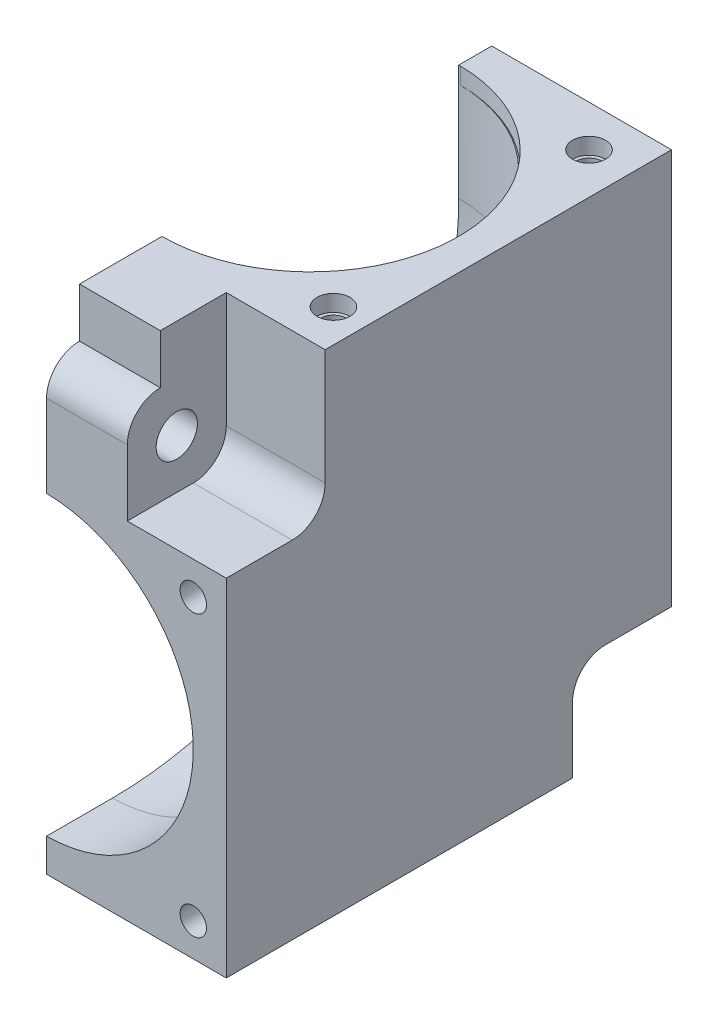
ISO-10303-21;
HEADER;
FILE_DESCRIPTION(('STEP AP214'),'2;1');
FILE_NAME('part.step','',(''),(''),'','','');
FILE_SCHEMA(('AUTOMOTIVE_DESIGN { 1 0 10303 214 1 1 1 1 }'));
ENDSEC;
DATA;
#1=APPLICATION_CONTEXT('core data for automotive mechanical design processes');
#2=APPLICATION_PROTOCOL_DEFINITION('international standard','automotive_design',2000,#1);
#3=PRODUCT_CONTEXT('',#1,'mechanical');
#4=PRODUCT('Part','Part','',(#3));
#5=PRODUCT_RELATED_PRODUCT_CATEGORY('part','',(#4));
#6=PRODUCT_DEFINITION_FORMATION('','',#4);
#7=PRODUCT_DEFINITION_CONTEXT('part definition',#1,'design');
#8=PRODUCT_DEFINITION('design','',#6,#7);
#9=PRODUCT_DEFINITION_SHAPE('','',#8);
#10=(LENGTH_UNIT() NAMED_UNIT(*) SI_UNIT(.MILLI.,.METRE.));
#11=(NAMED_UNIT(*) PLANE_ANGLE_UNIT() SI_UNIT($,.RADIAN.));
#12=(NAMED_UNIT(*) SI_UNIT($,.STERADIAN.) SOLID_ANGLE_UNIT());
#13=UNCERTAINTY_MEASURE_WITH_UNIT(LENGTH_MEASURE(1.E-05),#10,'distance_accuracy_value','');
#14=(GEOMETRIC_REPRESENTATION_CONTEXT(3) GLOBAL_UNCERTAINTY_ASSIGNED_CONTEXT((#13)) GLOBAL_UNIT_ASSIGNED_CONTEXT((#10,
#11,#12)) REPRESENTATION_CONTEXT('',''));
#15=CARTESIAN_POINT('',(0.,0.,0.));
#16=DIRECTION('',(0.,0.,1.));
#17=DIRECTION('',(1.,0.,0.));
#18=AXIS2_PLACEMENT_3D('',#15,#16,#17);
#19=CARTESIAN_POINT('',(-21.94092982825,118.281418193,122.6520423712));
#20=DIRECTION('',(0.,1.,0.));
#21=DIRECTION('',(0.,0.,1.));
#22=AXIS2_PLACEMENT_3D('',#19,#20,#21);
#23=CONICAL_SURFACE('',#22,0.,1.029744258646);
#24=CARTESIAN_POINT('',(-21.94092982825,118.281418193,122.6520423712));
#25=VERTEX_POINT('',#24);
#26=VERTEX_LOOP('',#25);
#27=FACE_BOUND('',#26,.T.);
#28=CARTESIAN_POINT('',(-21.94092982825,118.7621066882,122.6520423712));
#29=DIRECTION('',(0.,1.,0.));
#30=DIRECTION('',(1.,0.,0.));
#31=AXIS2_PLACEMENT_3D('',#28,#29,#30);
#32=CIRCLE('',#31,0.799999999999999);
#33=CARTESIAN_POINT('',(-21.14092982825,118.7621066882,122.6520423712));
#34=VERTEX_POINT('',#33);
#35=EDGE_CURVE('E220',#34,#34,#32,.F.);
#36=ORIENTED_EDGE('',*,*,#35,.F.);
#37=EDGE_LOOP('',(#36));
#38=FACE_BOUND('',#37,.T.);
#39=ADVANCED_FACE('F16',(#27,#38),#23,.F.);
#40=CARTESIAN_POINT('',(-21.44092982825,118.281418193,138.6520423712));
#41=DIRECTION('',(0.,1.,0.));
#42=DIRECTION('',(0.,0.,1.));
#43=AXIS2_PLACEMENT_3D('',#40,#41,#42);
#44=CONICAL_SURFACE('',#43,0.,1.02974425864599);
#45=CARTESIAN_POINT('',(-21.44092982825,118.281418193,138.6520423712));
#46=VERTEX_POINT('',#45);
#47=VERTEX_LOOP('',#46);
#48=FACE_BOUND('',#47,.T.);
#49=CARTESIAN_POINT('',(-21.44092982825,118.7621066882,138.6520423712));
#50=DIRECTION('',(0.,1.,0.));
#51=DIRECTION('',(1.,0.,0.));
#52=AXIS2_PLACEMENT_3D('',#49,#50,#51);
#53=CIRCLE('',#52,0.800000000000002);
#54=CARTESIAN_POINT('',(-20.64092982825,118.7621066882,138.6520423712));
#55=VERTEX_POINT('',#54);
#56=EDGE_CURVE('E216',#55,#55,#53,.F.);
#57=ORIENTED_EDGE('',*,*,#56,.F.);
#58=EDGE_LOOP('',(#57));
#59=FACE_BOUND('',#58,.T.);
#60=ADVANCED_FACE('F538',(#48,#59),#44,.F.);
#61=CARTESIAN_POINT('',(-21.94092982825,118.7621066882,122.6520423712));
#62=DIRECTION('',(0.,1.,0.));
#63=DIRECTION('',(0.,0.,1.));
#64=AXIS2_PLACEMENT_3D('',#61,#62,#63);
#65=CYLINDRICAL_SURFACE('',#64,0.799999999999999);
#66=CARTESIAN_POINT('',(-21.94092982825,124.7621066882,122.6520423712));
#67=DIRECTION('',(0.,1.,0.));
#68=DIRECTION('',(0.,0.,1.));
#69=AXIS2_PLACEMENT_3D('',#66,#67,#68);
#70=CIRCLE('',#69,0.799999999999999);
#71=CARTESIAN_POINT('',(-21.94092982825,124.7621066882,123.4520423712));
#72=VERTEX_POINT('',#71);
#73=EDGE_CURVE('E20',#72,#72,#70,.F.);
#74=ORIENTED_EDGE('',*,*,#73,.F.);
#75=EDGE_LOOP('',(#74));
#76=FACE_BOUND('',#75,.T.);
#77=ORIENTED_EDGE('',*,*,#35,.T.);
#78=EDGE_LOOP('',(#77));
#79=FACE_BOUND('',#78,.T.);
#80=ADVANCED_FACE('F344',(#76,#79),#65,.F.);
#81=CARTESIAN_POINT('',(-21.44092982825,118.7621066882,138.6520423712));
#82=DIRECTION('',(0.,1.,0.));
#83=DIRECTION('',(0.,0.,1.));
#84=AXIS2_PLACEMENT_3D('',#81,#82,#83);
#85=CYLINDRICAL_SURFACE('',#84,0.800000000000002);
#86=CARTESIAN_POINT('',(-21.44092982825,124.7621066882,138.6520423712));
#87=DIRECTION('',(0.,1.,0.));
#88=DIRECTION('',(0.,0.,1.));
#89=AXIS2_PLACEMENT_3D('',#86,#87,#88);
#90=CIRCLE('',#89,0.800000000000002);
#91=CARTESIAN_POINT('',(-21.44092982825,124.7621066882,139.4520423712));
#92=VERTEX_POINT('',#91);
#93=EDGE_CURVE('E203',#92,#92,#90,.F.);
#94=ORIENTED_EDGE('',*,*,#93,.F.);
#95=EDGE_LOOP('',(#94));
#96=FACE_BOUND('',#95,.T.);
#97=ORIENTED_EDGE('',*,*,#56,.T.);
#98=EDGE_LOOP('',(#97));
#99=FACE_BOUND('',#98,.T.);
#100=ADVANCED_FACE('F335',(#96,#99),#85,.F.);
#101=CARTESIAN_POINT('',(-20.89076503479,124.7621066882,123.7022105524));
#102=DIRECTION('',(0.,1.,0.));
#103=DIRECTION('',(0.,0.,-1.));
#104=AXIS2_PLACEMENT_3D('',#101,#102,#103);
#105=PLANE('',#104);
#106=ORIENTED_EDGE('',*,*,#73,.T.);
#107=EDGE_LOOP('',(#106));
#108=FACE_BOUND('',#107,.T.);
#109=CARTESIAN_POINT('',(-21.94092982825,124.762106688251,122.6520423712));
#110=DIRECTION('',(0.,-1.,0.));
#111=DIRECTION('',(0.,0.,-1.));
#112=AXIS2_PLACEMENT_3D('',#109,#110,#111);
#113=CIRCLE('',#112,0.999999999999994);
#114=CARTESIAN_POINT('',(-21.94092982825,124.762106688251,121.6520423712));
#115=VERTEX_POINT('',#114);
#116=EDGE_CURVE('E180',#115,#115,#113,.T.);
#117=ORIENTED_EDGE('',*,*,#116,.F.);
#118=EDGE_LOOP('',(#117));
#119=FACE_BOUND('',#118,.T.);
#120=ADVANCED_FACE('F332',(#108,#119),#105,.T.);
#121=CARTESIAN_POINT('',(-20.39076503479,124.7621066882,139.7022105524));
#122=DIRECTION('',(0.,1.,0.));
#123=DIRECTION('',(0.,0.,-1.));
#124=AXIS2_PLACEMENT_3D('',#121,#122,#123);
#125=PLANE('',#124);
#126=ORIENTED_EDGE('',*,*,#93,.T.);
#127=EDGE_LOOP('',(#126));
#128=FACE_BOUND('',#127,.T.);
#129=CARTESIAN_POINT('',(-21.44092982825,124.762106688251,138.6520423712));
#130=DIRECTION('',(0.,-1.,0.));
#131=DIRECTION('',(0.,0.,-1.));
#132=AXIS2_PLACEMENT_3D('',#129,#130,#131);
#133=CIRCLE('',#132,1.);
#134=CARTESIAN_POINT('',(-21.44092982825,124.762106688251,137.6520423712));
#135=VERTEX_POINT('',#134);
#136=EDGE_CURVE('E321',#135,#135,#133,.T.);
#137=ORIENTED_EDGE('',*,*,#136,.F.);
#138=EDGE_LOOP('',(#137));
#139=FACE_BOUND('',#138,.T.);
#140=ADVANCED_FACE('F334',(#128,#139),#125,.T.);
#141=CARTESIAN_POINT('',(-21.15554887249,124.7621066882,140.5114312426));
#142=DIRECTION('',(0.,1.,0.));
#143=DIRECTION('',(0.,0.,-1.));
#144=AXIS2_PLACEMENT_3D('',#141,#142,#143);
#145=PLANE('',#144);
#146=CARTESIAN_POINT('',(-30.44092982825,124.7621066882,131.1520423712));
#147=DIRECTION('',(0.,1.,0.));
#148=DIRECTION('',(-1.,0.,0.));
#149=AXIS2_PLACEMENT_3D('',#146,#147,#148);
#150=CIRCLE('',#149,9.00000000000003);
#151=CARTESIAN_POINT('',(-30.3409298283999,124.762106688238,140.15148679853));
#152=VERTEX_POINT('',#151);
#153=CARTESIAN_POINT('',(-30.2409421747683,124.762106688238,122.154264593412));
#154=VERTEX_POINT('',#153);
#155=EDGE_CURVE('E166',#152,#154,#150,.T.);
#156=ORIENTED_EDGE('',*,*,#155,.F.);
#157=CARTESIAN_POINT('',(-30.34092982825,124.762106688251,131.1525979439));
#158=DIRECTION('',(0.,-1.,0.));
#159=DIRECTION('',(0.,0.,-1.));
#160=AXIS2_PLACEMENT_3D('',#157,#158,#159);
#161=CIRCLE('',#160,8.99888885459998);
#162=EDGE_CURVE('E171',#154,#152,#161,.T.);
#163=ORIENTED_EDGE('',*,*,#162,.F.);
#164=EDGE_LOOP('',(#156,#163));
#165=FACE_BOUND('',#164,.T.);
#166=ADVANCED_FACE('F194',(#165),#145,.T.);
#167=CARTESIAN_POINT('',(-30.34092982825,125.762106688249,131.1525979439));
#168=DIRECTION('',(0.,-1.,0.));
#169=DIRECTION('',(0.,0.,-1.));
#170=AXIS2_PLACEMENT_3D('',#167,#168,#169);
#171=CYLINDRICAL_SURFACE('',#170,8.99888885459998);
#172=DIRECTION('',(0.,1.,0.));
#173=VECTOR('',#172,1.);
#174=CARTESIAN_POINT('',(-30.2409421743138,122.2621066882,122.154264593422));
#175=LINE('',#174,#173);
#176=CARTESIAN_POINT('',(-30.2409421747683,125.762106688237,122.154264593412));
#177=VERTEX_POINT('',#176);
#178=EDGE_CURVE('E177',#154,#177,#175,.T.);
#179=ORIENTED_EDGE('',*,*,#178,.F.);
#180=ORIENTED_EDGE('',*,*,#162,.T.);
#181=DIRECTION('',(0.,1.,0.));
#182=VECTOR('',#181,1.);
#183=CARTESIAN_POINT('',(-30.3409298282537,125.26210668825,140.1514867985));
#184=LINE('',#183,#182);
#185=CARTESIAN_POINT('',(-30.3409298282519,125.762106688249,140.1514867985));
#186=VERTEX_POINT('',#185);
#187=EDGE_CURVE('E175',#152,#186,#184,.T.);
#188=ORIENTED_EDGE('',*,*,#187,.T.);
#189=CARTESIAN_POINT('',(-30.34092982825,125.762106688249,131.1525979439));
#190=DIRECTION('',(0.,-1.,0.));
#191=DIRECTION('',(0.,0.,-1.));
#192=AXIS2_PLACEMENT_3D('',#189,#190,#191);
#193=CIRCLE('',#192,8.99888885459998);
#194=EDGE_CURVE('E307',#177,#186,#193,.T.);
#195=ORIENTED_EDGE('',*,*,#194,.F.);
#196=EDGE_LOOP('',(#179,#180,#188,#195));
#197=FACE_BOUND('',#196,.T.);
#198=ADVANCED_FACE('F172',(#197),#171,.F.);
#199=CARTESIAN_POINT('',(-21.94092982825,125.762106688249,122.6520423712));
#200=DIRECTION('',(0.,-1.,0.));
#201=DIRECTION('',(0.,0.,-1.));
#202=AXIS2_PLACEMENT_3D('',#199,#200,#201);
#203=CYLINDRICAL_SURFACE('',#202,0.999999999999994);
#204=CARTESIAN_POINT('',(-21.94092982825,125.762106688249,122.6520423712));
#205=DIRECTION('',(0.,-1.,0.));
#206=DIRECTION('',(0.,0.,-1.));
#207=AXIS2_PLACEMENT_3D('',#204,#205,#206);
#208=CIRCLE('',#207,0.999999999999994);
#209=CARTESIAN_POINT('',(-21.94092982825,125.762106688249,121.6520423712));
#210=VERTEX_POINT('',#209);
#211=EDGE_CURVE('E302',#210,#210,#208,.T.);
#212=ORIENTED_EDGE('',*,*,#211,.F.);
#213=EDGE_LOOP('',(#212));
#214=FACE_BOUND('',#213,.T.);
#215=ORIENTED_EDGE('',*,*,#116,.T.);
#216=EDGE_LOOP('',(#215));
#217=FACE_BOUND('',#216,.T.);
#218=ADVANCED_FACE('F330',(#214,#217),#203,.F.);
#219=CARTESIAN_POINT('',(-21.44092982825,125.762106688249,138.6520423712));
#220=DIRECTION('',(0.,-1.,0.));
#221=DIRECTION('',(0.,0.,-1.));
#222=AXIS2_PLACEMENT_3D('',#219,#220,#221);
#223=CYLINDRICAL_SURFACE('',#222,1.);
#224=CARTESIAN_POINT('',(-21.44092982825,125.762106688249,138.6520423712));
#225=DIRECTION('',(0.,-1.,0.));
#226=DIRECTION('',(0.,0.,-1.));
#227=AXIS2_PLACEMENT_3D('',#224,#225,#226);
#228=CIRCLE('',#227,1.);
#229=CARTESIAN_POINT('',(-21.44092982825,125.762106688249,137.6520423712));
#230=VERTEX_POINT('',#229);
#231=EDGE_CURVE('E297',#230,#230,#228,.T.);
#232=ORIENTED_EDGE('',*,*,#231,.F.);
#233=EDGE_LOOP('',(#232));
#234=FACE_BOUND('',#233,.T.);
#235=ORIENTED_EDGE('',*,*,#136,.T.);
#236=EDGE_LOOP('',(#235));
#237=FACE_BOUND('',#236,.T.);
#238=ADVANCED_FACE('F527',(#234,#237),#223,.F.);
#239=CARTESIAN_POINT('',(-25.44092982825,95.64210668824,120.0320423712));
#240=DIRECTION('',(-1.,0.,0.));
#241=DIRECTION('',(0.,0.,1.));
#242=AXIS2_PLACEMENT_3D('',#239,#240,#241);
#243=PLANE('',#242);
#244=CARTESIAN_POINT('',(-25.4409298282502,98.76210668824,123.1520423712));
#245=DIRECTION('',(1.,0.,0.));
#246=DIRECTION('',(0.,0.,-1.));
#247=AXIS2_PLACEMENT_3D('',#244,#245,#246);
#248=CIRCLE('',#247,1.25000000000003);
#249=CARTESIAN_POINT('',(-25.4409298282502,98.76210668824,121.9020423712));
#250=VERTEX_POINT('',#249);
#251=EDGE_CURVE('E313',#250,#250,#248,.T.);
#252=ORIENTED_EDGE('',*,*,#251,.F.);
#253=EDGE_LOOP('',(#252));
#254=FACE_BOUND('',#253,.T.);
#255=CARTESIAN_POINT('',(-25.4409298282498,99.76210668824,124.1520423712));
#256=DIRECTION('',(-1.,0.,0.));
#257=DIRECTION('',(0.,0.,1.));
#258=AXIS2_PLACEMENT_3D('',#255,#256,#257);
#259=CIRCLE('',#258,2.00000000000002);
#260=CARTESIAN_POINT('',(-25.4409298282499,99.76210668824,126.1520423712));
#261=VERTEX_POINT('',#260);
#262=CARTESIAN_POINT('',(-25.4409298282498,101.76210668822,124.1520423712));
#263=VERTEX_POINT('',#262);
#264=EDGE_CURVE('E292',#261,#263,#259,.T.);
#265=ORIENTED_EDGE('',*,*,#264,.F.);
#266=DIRECTION('',(0.,-1.,0.));
#267=VECTOR('',#266,1.);
#268=CARTESIAN_POINT('',(-25.44092982825,97.76210668824,126.1520423712));
#269=LINE('',#268,#267);
#270=CARTESIAN_POINT('',(-25.44092982825,95.76210668824,126.1520423712));
#271=VERTEX_POINT('',#270);
#272=EDGE_CURVE('E447',#261,#271,#269,.T.);
#273=ORIENTED_EDGE('',*,*,#272,.T.);
#274=DIRECTION('',(0.,0.,-1.));
#275=VECTOR('',#274,1.);
#276=CARTESIAN_POINT('',(-25.44092982825,95.76210668824,134.6520423712));
#277=LINE('',#276,#275);
#278=CARTESIAN_POINT('',(-25.4409298282501,95.76210668824,122.1520423712));
#279=VERTEX_POINT('',#278);
#280=EDGE_CURVE('E463',#271,#279,#277,.T.);
#281=ORIENTED_EDGE('',*,*,#280,.T.);
#282=CARTESIAN_POINT('',(-25.4409298282502,97.76210668824,122.1520423712));
#283=DIRECTION('',(1.,0.,0.));
#284=DIRECTION('',(0.,0.,-1.));
#285=AXIS2_PLACEMENT_3D('',#282,#283,#284);
#286=CIRCLE('',#285,2.);
#287=CARTESIAN_POINT('',(-25.4409298282501,97.7621066882396,120.1520423712));
#288=VERTEX_POINT('',#287);
#289=EDGE_CURVE('E317',#279,#288,#286,.T.);
#290=ORIENTED_EDGE('',*,*,#289,.T.);
#291=DIRECTION('',(0.,-1.,0.));
#292=VECTOR('',#291,1.);
#293=CARTESIAN_POINT('',(-25.44092982825,111.76210668822,120.1520423712));
#294=LINE('',#293,#292);
#295=CARTESIAN_POINT('',(-25.44092982825,101.7621066882,120.1520423712));
#296=VERTEX_POINT('',#295);
#297=EDGE_CURVE('E484',#296,#288,#294,.T.);
#298=ORIENTED_EDGE('',*,*,#297,.F.);
#299=DIRECTION('',(0.,0.,1.));
#300=VECTOR('',#299,1.);
#301=CARTESIAN_POINT('',(-25.44092982825,101.7621066882,122.1520423712));
#302=LINE('',#301,#300);
#303=EDGE_CURVE('E474',#296,#263,#302,.T.);
#304=ORIENTED_EDGE('',*,*,#303,.T.);
#305=EDGE_LOOP('',(#265,#273,#281,#290,#298,#304));
#306=FACE_BOUND('',#305,.T.);
#307=ADVANCED_FACE('F525',(#254,#306),#243,.F.);
#308=CARTESIAN_POINT('',(-30.34092982825,97.76210668824,122.1520423712));
#309=DIRECTION('',(1.,0.,0.));
#310=DIRECTION('',(0.,0.,-1.));
#311=AXIS2_PLACEMENT_3D('',#308,#309,#310);
#312=CYLINDRICAL_SURFACE('',#311,2.);
#313=ORIENTED_EDGE('',*,*,#289,.F.);
#314=DIRECTION('',(-1.,0.,0.));
#315=VECTOR('',#314,1.);
#316=CARTESIAN_POINT('',(-24.89092982825,95.76210668824,122.1520423712));
#317=LINE('',#316,#315);
#318=CARTESIAN_POINT('',(-30.34092982825,95.7621066882396,122.1520423712));
#319=VERTEX_POINT('',#318);
#320=EDGE_CURVE('E446',#279,#319,#317,.T.);
#321=ORIENTED_EDGE('',*,*,#320,.T.);
#322=CARTESIAN_POINT('',(-30.34092982825,97.76210668824,122.1520423712));
#323=DIRECTION('',(1.,0.,0.));
#324=DIRECTION('',(0.,0.,-1.));
#325=AXIS2_PLACEMENT_3D('',#322,#323,#324);
#326=CIRCLE('',#325,2.);
#327=CARTESIAN_POINT('',(-30.34092982825,97.7621066882396,120.1520423712));
#328=VERTEX_POINT('',#327);
#329=EDGE_CURVE('E282',#319,#328,#326,.T.);
#330=ORIENTED_EDGE('',*,*,#329,.T.);
#331=DIRECTION('',(-1.,0.,0.));
#332=VECTOR('',#331,1.);
#333=CARTESIAN_POINT('',(-24.89092982825,97.7621066882392,120.1520423712));
#334=LINE('',#333,#332);
#335=EDGE_CURVE('E946',#288,#328,#334,.T.);
#336=ORIENTED_EDGE('',*,*,#335,.F.);
#337=EDGE_LOOP('',(#313,#321,#330,#336));
#338=FACE_BOUND('',#337,.T.);
#339=ADVANCED_FACE('F521',(#338),#312,.T.);
#340=CARTESIAN_POINT('',(-30.34092982825,98.76210668824,123.1520423712));
#341=DIRECTION('',(1.,0.,0.));
#342=DIRECTION('',(0.,0.,-1.));
#343=AXIS2_PLACEMENT_3D('',#340,#341,#342);
#344=CYLINDRICAL_SURFACE('',#343,1.25000000000003);
#345=ORIENTED_EDGE('',*,*,#251,.T.);
#346=EDGE_LOOP('',(#345));
#347=FACE_BOUND('',#346,.T.);
#348=CARTESIAN_POINT('',(-30.34092982825,98.76210668824,123.1520423712));
#349=DIRECTION('',(1.,0.,0.));
#350=DIRECTION('',(0.,0.,-1.));
#351=AXIS2_PLACEMENT_3D('',#348,#349,#350);
#352=CIRCLE('',#351,1.25000000000003);
#353=CARTESIAN_POINT('',(-30.34092982825,98.76210668824,121.9020423712));
#354=VERTEX_POINT('',#353);
#355=EDGE_CURVE('E276',#354,#354,#352,.F.);
#356=ORIENTED_EDGE('',*,*,#355,.T.);
#357=EDGE_LOOP('',(#356));
#358=FACE_BOUND('',#357,.T.);
#359=ADVANCED_FACE('F516',(#347,#358),#344,.F.);
#360=CARTESIAN_POINT('',(-30.44092982825,118.7621066882,143.1520423712));
#361=DIRECTION('',(-1.,0.,0.));
#362=DIRECTION('',(0.,0.,1.));
#363=AXIS2_PLACEMENT_3D('',#360,#361,#362);
#364=TOROIDAL_SURFACE('',#363,12.,9.);
#365=CARTESIAN_POINT('',(-30.44092982825,118.7621066882,131.1520423712));
#366=DIRECTION('',(0.,1.,0.));
#367=DIRECTION('',(0.,0.,-1.));
#368=AXIS2_PLACEMENT_3D('',#365,#366,#367);
#369=CIRCLE('',#368,9.00000000000004);
#370=CARTESIAN_POINT('',(-30.34092982825,118.7621066882,122.152597943902));
#371=VERTEX_POINT('',#370);
#372=CARTESIAN_POINT('',(-30.34092982825,118.7621066882,140.151486798528));
#373=VERTEX_POINT('',#372);
#374=EDGE_CURVE('E186',#371,#373,#369,.F.);
#375=ORIENTED_EDGE('',*,*,#374,.F.);
#376=CARTESIAN_POINT('',(-30.34092982825,118.7621066882,143.1520423712));
#377=DIRECTION('',(-1.,0.,0.));
#378=DIRECTION('',(0.,0.,1.));
#379=AXIS2_PLACEMENT_3D('',#376,#377,#378);
#380=CIRCLE('',#379,20.9994444272966);
#381=CARTESIAN_POINT('',(-30.3409298282508,97.7626622609034,143.1520423712));
#382=VERTEX_POINT('',#381);
#383=EDGE_CURVE('E287',#371,#382,#380,.T.);
#384=ORIENTED_EDGE('',*,*,#383,.T.);
#385=CARTESIAN_POINT('',(-30.44092982825,106.7621066882,143.1520423712));
#386=DIRECTION('',(0.,0.,1.));
#387=DIRECTION('',(1.,0.,0.));
#388=AXIS2_PLACEMENT_3D('',#385,#386,#387);
#389=CIRCLE('',#388,8.99999999999999);
#390=CARTESIAN_POINT('',(-30.34092982825,115.761551115528,143.1520423712));
#391=VERTEX_POINT('',#390);
#392=EDGE_CURVE('E429',#391,#382,#389,.F.);
#393=ORIENTED_EDGE('',*,*,#392,.F.);
#394=CARTESIAN_POINT('',(-30.34092982825,118.7621066882,143.1520423712));
#395=DIRECTION('',(-1.,0.,0.));
#396=DIRECTION('',(0.,0.,1.));
#397=AXIS2_PLACEMENT_3D('',#394,#395,#396);
#398=CIRCLE('',#397,3.0005555727034);
#399=EDGE_CURVE('E192',#391,#373,#398,.F.);
#400=ORIENTED_EDGE('',*,*,#399,.T.);
#401=EDGE_LOOP('',(#375,#384,#393,#400));
#402=FACE_BOUND('',#401,.T.);
#403=ADVANCED_FACE('F512',(#402),#364,.F.);
#404=CARTESIAN_POINT('',(-30.44092982825,118.7621066882,131.1520423712));
#405=DIRECTION('',(0.,1.,0.));
#406=DIRECTION('',(-1.,0.,0.));
#407=AXIS2_PLACEMENT_3D('',#404,#405,#406);
#408=CYLINDRICAL_SURFACE('',#407,9.00000000000003);
#409=ORIENTED_EDGE('',*,*,#155,.T.);
#410=ORIENTED_EDGE('',*,*,#178,.T.);
#411=CARTESIAN_POINT('',(-30.44092982825,125.7621066882,131.1520423712));
#412=DIRECTION('',(0.,1.,0.));
#413=DIRECTION('',(0.,0.,1.));
#414=AXIS2_PLACEMENT_3D('',#411,#412,#413);
#415=CIRCLE('',#414,9.00000000000003);
#416=CARTESIAN_POINT('',(-30.34092982825,125.7621066882,122.152597943902));
#417=VERTEX_POINT('',#416);
#418=EDGE_CURVE('E215',#417,#177,#415,.F.);
#419=ORIENTED_EDGE('',*,*,#418,.F.);
#420=DIRECTION('',(0.,-1.,0.));
#421=VECTOR('',#420,1.);
#422=CARTESIAN_POINT('',(-30.34092982825,110.76210668822,122.1525979439));
#423=LINE('',#422,#421);
#424=EDGE_CURVE('E291',#417,#371,#423,.T.);
#425=ORIENTED_EDGE('',*,*,#424,.T.);
#426=ORIENTED_EDGE('',*,*,#374,.T.);
#427=DIRECTION('',(0.,1.,0.));
#428=VECTOR('',#427,1.);
#429=CARTESIAN_POINT('',(-30.34092982825,120.7618289019,140.15148679856));
#430=LINE('',#429,#428);
#431=EDGE_CURVE('E183',#373,#152,#430,.T.);
#432=ORIENTED_EDGE('',*,*,#431,.T.);
#433=EDGE_LOOP('',(#409,#410,#419,#425,#426,#432));
#434=FACE_BOUND('',#433,.T.);
#435=ADVANCED_FACE('F184',(#434),#408,.F.);
#436=CARTESIAN_POINT('',(-21.44092982825,97.76210668824,140.671353876));
#437=DIRECTION('',(0.,0.,1.));
#438=DIRECTION('',(1.,0.,0.));
#439=AXIS2_PLACEMENT_3D('',#436,#437,#438);
#440=CONICAL_SURFACE('',#439,0.,1.02974425864605);
#441=CARTESIAN_POINT('',(-21.44092982825,97.76210668824,140.671353876));
#442=VERTEX_POINT('',#441);
#443=VERTEX_LOOP('',#442);
#444=FACE_BOUND('',#443,.T.);
#445=CARTESIAN_POINT('',(-21.44092982825,97.76210668824,141.1520423712));
#446=DIRECTION('',(0.,0.,1.));
#447=DIRECTION('',(-1.,0.,0.));
#448=AXIS2_PLACEMENT_3D('',#445,#446,#447);
#449=CIRCLE('',#448,0.799999999999995);
#450=CARTESIAN_POINT('',(-22.24092982825,97.76210668824,141.1520423712));
#451=VERTEX_POINT('',#450);
#452=EDGE_CURVE('E495',#451,#451,#449,.F.);
#453=ORIENTED_EDGE('',*,*,#452,.F.);
#454=EDGE_LOOP('',(#453));
#455=FACE_BOUND('',#454,.T.);
#456=ADVANCED_FACE('F625',(#444,#455),#440,.F.);
#457=CARTESIAN_POINT('',(-21.44092982825,114.7621066882,140.671353876));
#458=DIRECTION('',(0.,0.,1.));
#459=DIRECTION('',(1.,0.,0.));
#460=AXIS2_PLACEMENT_3D('',#457,#458,#459);
#461=CONICAL_SURFACE('',#460,0.,1.02974425864605);
#462=CARTESIAN_POINT('',(-21.44092982825,114.7621066882,140.671353876));
#463=VERTEX_POINT('',#462);
#464=VERTEX_LOOP('',#463);
#465=FACE_BOUND('',#464,.T.);
#466=CARTESIAN_POINT('',(-21.44092982825,114.7621066882,141.1520423712));
#467=DIRECTION('',(0.,0.,1.));
#468=DIRECTION('',(-1.,0.,0.));
#469=AXIS2_PLACEMENT_3D('',#466,#467,#468);
#470=CIRCLE('',#469,0.799999999999995);
#471=CARTESIAN_POINT('',(-22.24092982825,114.7621066882,141.1520423712));
#472=VERTEX_POINT('',#471);
#473=EDGE_CURVE('E490',#472,#472,#470,.F.);
#474=ORIENTED_EDGE('',*,*,#473,.F.);
#475=EDGE_LOOP('',(#474));
#476=FACE_BOUND('',#475,.T.);
#477=ADVANCED_FACE('F632',(#465,#476),#461,.F.);
#478=CARTESIAN_POINT('',(-25.34292982825,125.8221066882,145.1520423712));
#479=DIRECTION('',(0.,0.,-1.));
#480=DIRECTION('',(0.,-1.,0.));
#481=AXIS2_PLACEMENT_3D('',#478,#479,#480);
#482=PLANE('',#481);
#483=DIRECTION('',(1.,0.,0.));
#484=VECTOR('',#483,1.);
#485=CARTESIAN_POINT('',(-27.89092982825,122.7621066882,145.1520423712));
#486=LINE('',#485,#484);
#487=CARTESIAN_POINT('',(-30.34092982825,122.7621066882,145.152042371227));
#488=VERTEX_POINT('',#487);
#489=CARTESIAN_POINT('',(-25.4409298282502,122.7621066882,145.1520423712));
#490=VERTEX_POINT('',#489);
#491=EDGE_CURVE('E269',#488,#490,#486,.T.);
#492=ORIENTED_EDGE('',*,*,#491,.T.);
#493=DIRECTION('',(0.,1.,0.));
#494=VECTOR('',#493,1.);
#495=CARTESIAN_POINT('',(-25.44092982825,121.2621066882,145.1520423712));
#496=LINE('',#495,#494);
#497=CARTESIAN_POINT('',(-25.44092982825,125.7621066882,145.1520423712));
#498=VERTEX_POINT('',#497);
#499=EDGE_CURVE('E259',#490,#498,#496,.T.);
#500=ORIENTED_EDGE('',*,*,#499,.T.);
#501=DIRECTION('',(1.,0.,0.));
#502=VECTOR('',#501,1.);
#503=CARTESIAN_POINT('',(-24.89092982825,125.7621066882,145.1520423712));
#504=LINE('',#503,#502);
#505=CARTESIAN_POINT('',(-30.34092982825,125.762106688233,145.152042371226));
#506=VERTEX_POINT('',#505);
#507=EDGE_CURVE('E306',#506,#498,#504,.T.);
#508=ORIENTED_EDGE('',*,*,#507,.F.);
#509=DIRECTION('',(0.,-1.,0.));
#510=VECTOR('',#509,1.);
#511=CARTESIAN_POINT('',(-30.34092982825,120.7618289019,145.152042371253));
#512=LINE('',#511,#510);
#513=EDGE_CURVE('E421',#506,#488,#512,.T.);
#514=ORIENTED_EDGE('',*,*,#513,.T.);
#515=EDGE_LOOP('',(#492,#500,#508,#514));
#516=FACE_BOUND('',#515,.T.);
#517=ADVANCED_FACE('F640',(#516),#482,.F.);
#518=CARTESIAN_POINT('',(-30.34092982825,119.7621066882,144.1520423712));
#519=DIRECTION('',(1.,0.,0.));
#520=DIRECTION('',(0.,0.,-1.));
#521=AXIS2_PLACEMENT_3D('',#518,#519,#520);
#522=CYLINDRICAL_SURFACE('',#521,1.25);
#523=CARTESIAN_POINT('',(-25.4409298282502,119.7621066882,144.1520423712));
#524=DIRECTION('',(1.,0.,0.));
#525=DIRECTION('',(0.,0.,-1.));
#526=AXIS2_PLACEMENT_3D('',#523,#524,#525);
#527=CIRCLE('',#526,1.25);
#528=CARTESIAN_POINT('',(-25.4409298282502,119.7621066882,142.9020423712));
#529=VERTEX_POINT('',#528);
#530=EDGE_CURVE('E255',#529,#529,#527,.T.);
#531=ORIENTED_EDGE('',*,*,#530,.T.);
#532=EDGE_LOOP('',(#531));
#533=FACE_BOUND('',#532,.T.);
#534=CARTESIAN_POINT('',(-30.34092982825,119.7621066882,144.1520423712));
#535=DIRECTION('',(1.,0.,0.));
#536=DIRECTION('',(0.,0.,-1.));
#537=AXIS2_PLACEMENT_3D('',#534,#535,#536);
#538=CIRCLE('',#537,1.25);
#539=CARTESIAN_POINT('',(-30.34092982825,119.7621066882,142.9020423712));
#540=VERTEX_POINT('',#539);
#541=EDGE_CURVE('E191',#540,#540,#538,.F.);
#542=ORIENTED_EDGE('',*,*,#541,.T.);
#543=EDGE_LOOP('',(#542));
#544=FACE_BOUND('',#543,.T.);
#545=ADVANCED_FACE('F649',(#533,#544),#522,.F.);
#546=CARTESIAN_POINT('',(-30.55892982825,125.7621066882,145.6520423712));
#547=DIRECTION('',(0.,1.,0.));
#548=DIRECTION('',(1.,0.,0.));
#549=AXIS2_PLACEMENT_3D('',#546,#547,#548);
#550=PLANE('',#549);
#551=ORIENTED_EDGE('',*,*,#231,.T.);
#552=EDGE_LOOP('',(#551));
#553=FACE_BOUND('',#552,.T.);
#554=ORIENTED_EDGE('',*,*,#211,.T.);
#555=EDGE_LOOP('',(#554));
#556=FACE_BOUND('',#555,.T.);
#557=ORIENTED_EDGE('',*,*,#507,.T.);
#558=DIRECTION('',(0.,0.,-1.));
#559=VECTOR('',#558,1.);
#560=CARTESIAN_POINT('',(-25.44092982825,125.7621066882,144.1520423712));
#561=LINE('',#560,#559);
#562=CARTESIAN_POINT('',(-25.44092982825,125.7621066882,141.1520423712));
#563=VERTEX_POINT('',#562);
#564=EDGE_CURVE('E396',#498,#563,#561,.T.);
#565=ORIENTED_EDGE('',*,*,#564,.T.);
#566=DIRECTION('',(1.,0.,0.));
#567=VECTOR('',#566,1.);
#568=CARTESIAN_POINT('',(-22.44092982825,125.7621066882,141.1520423712));
#569=LINE('',#568,#567);
#570=CARTESIAN_POINT('',(-19.44092982825,125.762106688201,141.1520423712));
#571=VERTEX_POINT('',#570);
#572=EDGE_CURVE('E442',#563,#571,#569,.T.);
#573=ORIENTED_EDGE('',*,*,#572,.T.);
#574=DIRECTION('',(0.,0.,-1.));
#575=VECTOR('',#574,1.);
#576=CARTESIAN_POINT('',(-19.44092982825,125.762106688201,133.6520423712));
#577=LINE('',#576,#575);
#578=CARTESIAN_POINT('',(-19.44092982825,125.762106688201,120.1520423712));
#579=VERTEX_POINT('',#578);
#580=EDGE_CURVE('E450',#571,#579,#577,.T.);
#581=ORIENTED_EDGE('',*,*,#580,.T.);
#582=DIRECTION('',(1.,0.,0.));
#583=VECTOR('',#582,1.);
#584=CARTESIAN_POINT('',(-24.89092982825,125.762106688201,120.1520423712));
#585=LINE('',#584,#583);
#586=CARTESIAN_POINT('',(-30.34092982825,125.762106688201,120.1520423712));
#587=VERTEX_POINT('',#586);
#588=EDGE_CURVE('E301',#587,#579,#585,.T.);
#589=ORIENTED_EDGE('',*,*,#588,.F.);
#590=DIRECTION('',(0.,0.,1.));
#591=VECTOR('',#590,1.);
#592=CARTESIAN_POINT('',(-30.34092982825,125.762106688201,133.6520423712));
#593=LINE('',#592,#591);
#594=EDGE_CURVE('E441',#587,#417,#593,.T.);
#595=ORIENTED_EDGE('',*,*,#594,.T.);
#596=ORIENTED_EDGE('',*,*,#418,.T.);
#597=ORIENTED_EDGE('',*,*,#194,.T.);
#598=DIRECTION('',(0.,0.,1.));
#599=VECTOR('',#598,1.);
#600=CARTESIAN_POINT('',(-30.34092982825,125.76210668825,143.6517645849));
#601=LINE('',#600,#599);
#602=EDGE_CURVE('E201',#186,#506,#601,.T.);
#603=ORIENTED_EDGE('',*,*,#602,.T.);
#604=EDGE_LOOP('',(#557,#565,#573,#581,#589,#595,#596,#597,#603));
#605=FACE_BOUND('',#604,.T.);
#606=ADVANCED_FACE('F658',(#553,#556,#605),#550,.T.);
#607=CARTESIAN_POINT('',(-19.22292982825,126.3221066882,120.1520423712));
#608=DIRECTION('',(0.,0.,-1.));
#609=DIRECTION('',(0.,-1.,0.));
#610=AXIS2_PLACEMENT_3D('',#607,#608,#609);
#611=PLANE('',#610);
#612=ORIENTED_EDGE('',*,*,#297,.T.);
#613=ORIENTED_EDGE('',*,*,#335,.T.);
#614=DIRECTION('',(0.,1.,0.));
#615=VECTOR('',#614,1.);
#616=CARTESIAN_POINT('',(-30.34092982825,110.76210668822,120.1520423712));
#617=LINE('',#616,#615);
#618=EDGE_CURVE('E281',#328,#587,#617,.T.);
#619=ORIENTED_EDGE('',*,*,#618,.T.);
#620=ORIENTED_EDGE('',*,*,#588,.T.);
#621=DIRECTION('',(0.,-1.,0.));
#622=VECTOR('',#621,1.);
#623=CARTESIAN_POINT('',(-19.44092982825,110.76210668822,120.1520423712));
#624=LINE('',#623,#622);
#625=CARTESIAN_POINT('',(-19.44092982825,101.762106688221,120.1520423712));
#626=VERTEX_POINT('',#625);
#627=EDGE_CURVE('E454',#579,#626,#624,.T.);
#628=ORIENTED_EDGE('',*,*,#627,.T.);
#629=DIRECTION('',(-1.,0.,0.));
#630=VECTOR('',#629,1.);
#631=CARTESIAN_POINT('',(-22.44092982825,101.7621066882,120.1520423712));
#632=LINE('',#631,#630);
#633=EDGE_CURVE('E296',#626,#296,#632,.T.);
#634=ORIENTED_EDGE('',*,*,#633,.T.);
#635=EDGE_LOOP('',(#612,#613,#619,#620,#628,#634));
#636=FACE_BOUND('',#635,.T.);
#637=ADVANCED_FACE('F667',(#636),#611,.T.);
#638=CARTESIAN_POINT('',(-19.32092982825,101.7621066882,124.2320423712));
#639=DIRECTION('',(0.,1.,0.));
#640=DIRECTION('',(0.,0.,-1.));
#641=AXIS2_PLACEMENT_3D('',#638,#639,#640);
#642=PLANE('',#641);
#643=DIRECTION('',(0.,0.,1.));
#644=VECTOR('',#643,1.);
#645=CARTESIAN_POINT('',(-19.44092982825,101.762106688232,133.6520423712));
#646=LINE('',#645,#644);
#647=CARTESIAN_POINT('',(-19.44092982825,101.762106688236,124.1520423712));
#648=VERTEX_POINT('',#647);
#649=EDGE_CURVE('E250',#626,#648,#646,.T.);
#650=ORIENTED_EDGE('',*,*,#649,.T.);
#651=DIRECTION('',(1.,0.,0.));
#652=VECTOR('',#651,1.);
#653=CARTESIAN_POINT('',(-22.44092982825,101.76210668824,124.1520423712));
#654=LINE('',#653,#652);
#655=EDGE_CURVE('E295',#263,#648,#654,.T.);
#656=ORIENTED_EDGE('',*,*,#655,.F.);
#657=ORIENTED_EDGE('',*,*,#303,.F.);
#658=ORIENTED_EDGE('',*,*,#633,.F.);
#659=EDGE_LOOP('',(#650,#656,#657,#658));
#660=FACE_BOUND('',#659,.T.);
#661=ADVANCED_FACE('F676',(#660),#642,.F.);
#662=CARTESIAN_POINT('',(-19.44092982825,99.76210668824,124.1520423712));
#663=DIRECTION('',(-1.,0.,0.));
#664=DIRECTION('',(0.,0.,1.));
#665=AXIS2_PLACEMENT_3D('',#662,#663,#664);
#666=CYLINDRICAL_SURFACE('',#665,2.00000000000002);
#667=CARTESIAN_POINT('',(-19.44092982825,99.76210668824,124.1520423712));
#668=DIRECTION('',(-1.,0.,0.));
#669=DIRECTION('',(0.,0.,1.));
#670=AXIS2_PLACEMENT_3D('',#667,#668,#669);
#671=CIRCLE('',#670,2.00000000000002);
#672=CARTESIAN_POINT('',(-19.44092982825,99.76210668824,126.1520423712));
#673=VERTEX_POINT('',#672);
#674=EDGE_CURVE('E245',#648,#673,#671,.F.);
#675=ORIENTED_EDGE('',*,*,#674,.T.);
#676=DIRECTION('',(-1.,0.,0.));
#677=VECTOR('',#676,1.);
#678=CARTESIAN_POINT('',(-22.44092982825,99.76210668824,126.1520423712));
#679=LINE('',#678,#677);
#680=EDGE_CURVE('E466',#673,#261,#679,.T.);
#681=ORIENTED_EDGE('',*,*,#680,.T.);
#682=ORIENTED_EDGE('',*,*,#264,.T.);
#683=ORIENTED_EDGE('',*,*,#655,.T.);
#684=EDGE_LOOP('',(#675,#681,#682,#683));
#685=FACE_BOUND('',#684,.T.);
#686=ADVANCED_FACE('F685',(#685),#666,.F.);
#687=CARTESIAN_POINT('',(-25.56092982825,95.68210668824,126.1520423712));
#688=DIRECTION('',(0.,0.,1.));
#689=DIRECTION('',(1.,0.,0.));
#690=AXIS2_PLACEMENT_3D('',#687,#688,#689);
#691=PLANE('',#690);
#692=ORIENTED_EDGE('',*,*,#272,.F.);
#693=ORIENTED_EDGE('',*,*,#680,.F.);
#694=DIRECTION('',(0.,-1.,0.));
#695=VECTOR('',#694,1.);
#696=CARTESIAN_POINT('',(-19.44092982825,110.76210668822,126.1520423712));
#697=LINE('',#696,#695);
#698=CARTESIAN_POINT('',(-19.44092982825,95.7621066882395,126.1520423712));
#699=VERTEX_POINT('',#698);
#700=EDGE_CURVE('E249',#673,#699,#697,.T.);
#701=ORIENTED_EDGE('',*,*,#700,.T.);
#702=DIRECTION('',(-1.,0.,0.));
#703=VECTOR('',#702,1.);
#704=CARTESIAN_POINT('',(-24.89092982825,95.76210668824,126.1520423712));
#705=LINE('',#704,#703);
#706=EDGE_CURVE('E459',#699,#271,#705,.T.);
#707=ORIENTED_EDGE('',*,*,#706,.T.);
#708=EDGE_LOOP('',(#692,#693,#701,#707));
#709=FACE_BOUND('',#708,.T.);
#710=ADVANCED_FACE('F694',(#709),#691,.F.);
#711=CARTESIAN_POINT('',(-19.32092982825,118.6221066882,141.1520423712));
#712=DIRECTION('',(0.,0.,-1.));
#713=DIRECTION('',(-1.,0.,0.));
#714=AXIS2_PLACEMENT_3D('',#711,#712,#713);
#715=PLANE('',#714);
#716=DIRECTION('',(-1.,0.,0.));
#717=VECTOR('',#716,1.);
#718=CARTESIAN_POINT('',(-22.44092982825,118.7621066882,141.1520423712));
#719=LINE('',#718,#717);
#720=CARTESIAN_POINT('',(-19.44092982825,118.7621066882,141.1520423712));
#721=VERTEX_POINT('',#720);
#722=CARTESIAN_POINT('',(-25.4409298282499,118.7621066882,141.1520423712));
#723=VERTEX_POINT('',#722);
#724=EDGE_CURVE('E254',#721,#723,#719,.T.);
#725=ORIENTED_EDGE('',*,*,#724,.F.);
#726=DIRECTION('',(0.,1.,0.));
#727=VECTOR('',#726,1.);
#728=CARTESIAN_POINT('',(-19.44092982825,110.76210668822,141.1520423712));
#729=LINE('',#728,#727);
#730=EDGE_CURVE('E243',#721,#571,#729,.T.);
#731=ORIENTED_EDGE('',*,*,#730,.T.);
#732=ORIENTED_EDGE('',*,*,#572,.F.);
#733=DIRECTION('',(0.,-1.,0.));
#734=VECTOR('',#733,1.);
#735=CARTESIAN_POINT('',(-25.44092982825,121.2621066882,141.1520423712));
#736=LINE('',#735,#734);
#737=EDGE_CURVE('E264',#563,#723,#736,.T.);
#738=ORIENTED_EDGE('',*,*,#737,.T.);
#739=EDGE_LOOP('',(#725,#731,#732,#738));
#740=FACE_BOUND('',#739,.T.);
#741=ADVANCED_FACE('F703',(#740),#715,.F.);
#742=CARTESIAN_POINT('',(-19.22292982825,95.76210668824,121.6520423712));
#743=DIRECTION('',(0.,1.,0.));
#744=DIRECTION('',(-1.,0.,0.));
#745=AXIS2_PLACEMENT_3D('',#742,#743,#744);
#746=PLANE('',#745);
#747=ORIENTED_EDGE('',*,*,#706,.F.);
#748=DIRECTION('',(0.,0.,1.));
#749=VECTOR('',#748,1.);
#750=CARTESIAN_POINT('',(-19.44092982825,95.7621066882392,133.6520423712));
#751=LINE('',#750,#749);
#752=CARTESIAN_POINT('',(-19.44092982825,95.7621066882392,147.1520423712));
#753=VERTEX_POINT('',#752);
#754=EDGE_CURVE('E244',#699,#753,#751,.T.);
#755=ORIENTED_EDGE('',*,*,#754,.T.);
#756=DIRECTION('',(-1.,0.,0.));
#757=VECTOR('',#756,1.);
#758=CARTESIAN_POINT('',(-24.89092982825,95.7621066882392,147.1520423712));
#759=LINE('',#758,#757);
#760=CARTESIAN_POINT('',(-30.34092982825,95.7621066882392,147.1520423712));
#761=VERTEX_POINT('',#760);
#762=EDGE_CURVE('E409',#753,#761,#759,.T.);
#763=ORIENTED_EDGE('',*,*,#762,.T.);
#764=DIRECTION('',(0.,0.,-1.));
#765=VECTOR('',#764,1.);
#766=CARTESIAN_POINT('',(-30.34092982825,95.7621066882392,133.6520423712));
#767=LINE('',#766,#765);
#768=EDGE_CURVE('E286',#761,#319,#767,.T.);
#769=ORIENTED_EDGE('',*,*,#768,.T.);
#770=ORIENTED_EDGE('',*,*,#320,.F.);
#771=ORIENTED_EDGE('',*,*,#280,.F.);
#772=EDGE_LOOP('',(#747,#755,#763,#769,#770,#771));
#773=FACE_BOUND('',#772,.T.);
#774=ADVANCED_FACE('F712',(#773),#746,.F.);
#775=CARTESIAN_POINT('',(-30.34092982825,95.16210668824,119.6120423712));
#776=DIRECTION('',(1.,0.,0.));
#777=DIRECTION('',(0.,1.,0.));
#778=AXIS2_PLACEMENT_3D('',#775,#776,#777);
#779=PLANE('',#778);
#780=ORIENTED_EDGE('',*,*,#355,.F.);
#781=EDGE_LOOP('',(#780));
#782=FACE_BOUND('',#781,.T.);
#783=ORIENTED_EDGE('',*,*,#329,.F.);
#784=ORIENTED_EDGE('',*,*,#768,.F.);
#785=DIRECTION('',(0.,1.,0.));
#786=VECTOR('',#785,1.);
#787=CARTESIAN_POINT('',(-30.34092982825,108.26210668822,147.1520423712));
#788=LINE('',#787,#786);
#789=CARTESIAN_POINT('',(-30.3409298282508,97.7626622609034,147.1520423712));
#790=VERTEX_POINT('',#789);
#791=EDGE_CURVE('E238',#761,#790,#788,.T.);
#792=ORIENTED_EDGE('',*,*,#791,.T.);
#793=DIRECTION('',(0.,0.,1.));
#794=VECTOR('',#793,1.);
#795=CARTESIAN_POINT('',(-30.3409298282517,97.7626622609034,145.1520423712));
#796=LINE('',#795,#794);
#797=EDGE_CURVE('E280',#382,#790,#796,.T.);
#798=ORIENTED_EDGE('',*,*,#797,.F.);
#799=ORIENTED_EDGE('',*,*,#383,.F.);
#800=ORIENTED_EDGE('',*,*,#424,.F.);
#801=ORIENTED_EDGE('',*,*,#594,.F.);
#802=ORIENTED_EDGE('',*,*,#618,.F.);
#803=EDGE_LOOP('',(#783,#784,#792,#798,#799,#800,#801,#802));
#804=FACE_BOUND('',#803,.T.);
#805=ADVANCED_FACE('F721',(#782,#804),#779,.F.);
#806=CARTESIAN_POINT('',(-30.44092982825,106.7621066882,143.1520423712));
#807=DIRECTION('',(0.,0.,1.));
#808=DIRECTION('',(0.,-1.,0.));
#809=AXIS2_PLACEMENT_3D('',#806,#807,#808);
#810=CYLINDRICAL_SURFACE('',#809,9.);
#811=CARTESIAN_POINT('',(-30.44092982825,106.7621066882,147.1520423712));
#812=DIRECTION('',(0.,0.,1.));
#813=DIRECTION('',(0.,-1.,0.));
#814=AXIS2_PLACEMENT_3D('',#811,#812,#813);
#815=CIRCLE('',#814,9.);
#816=CARTESIAN_POINT('',(-30.34092982825,115.761551115528,147.1520423712));
#817=VERTEX_POINT('',#816);
#818=EDGE_CURVE('E233',#790,#817,#815,.T.);
#819=ORIENTED_EDGE('',*,*,#818,.T.);
#820=DIRECTION('',(0.,0.,-1.));
#821=VECTOR('',#820,1.);
#822=CARTESIAN_POINT('',(-30.34092982825,115.76155111556,143.6517645849));
#823=LINE('',#822,#821);
#824=EDGE_CURVE('E275',#817,#391,#823,.T.);
#825=ORIENTED_EDGE('',*,*,#824,.T.);
#826=ORIENTED_EDGE('',*,*,#392,.T.);
#827=ORIENTED_EDGE('',*,*,#797,.T.);
#828=EDGE_LOOP('',(#819,#825,#826,#827));
#829=FACE_BOUND('',#828,.T.);
#830=ADVANCED_FACE('F730',(#829),#810,.F.);
#831=CARTESIAN_POINT('',(-30.34092982825,115.5615400041,140.0114756871));
#832=DIRECTION('',(1.,0.,0.));
#833=DIRECTION('',(0.,1.,0.));
#834=AXIS2_PLACEMENT_3D('',#831,#832,#833);
#835=PLANE('',#834);
#836=ORIENTED_EDGE('',*,*,#541,.F.);
#837=EDGE_LOOP('',(#836));
#838=FACE_BOUND('',#837,.T.);
#839=ORIENTED_EDGE('',*,*,#431,.F.);
#840=ORIENTED_EDGE('',*,*,#399,.F.);
#841=ORIENTED_EDGE('',*,*,#824,.F.);
#842=DIRECTION('',(0.,1.,0.));
#843=VECTOR('',#842,1.);
#844=CARTESIAN_POINT('',(-30.34092982825,108.26210668822,147.1520423712));
#845=LINE('',#844,#843);
#846=CARTESIAN_POINT('',(-30.34092982825,120.7621066882,147.1520423712));
#847=VERTEX_POINT('',#846);
#848=EDGE_CURVE('E237',#817,#847,#845,.T.);
#849=ORIENTED_EDGE('',*,*,#848,.T.);
#850=CARTESIAN_POINT('',(-30.34092982825,120.7621066882,145.1520423712));
#851=DIRECTION('',(1.,0.,0.));
#852=DIRECTION('',(0.,0.,-1.));
#853=AXIS2_PLACEMENT_3D('',#850,#851,#852);
#854=CIRCLE('',#853,1.99999999999999);
#855=EDGE_CURVE('E265',#847,#488,#854,.F.);
#856=ORIENTED_EDGE('',*,*,#855,.T.);
#857=ORIENTED_EDGE('',*,*,#513,.F.);
#858=ORIENTED_EDGE('',*,*,#602,.F.);
#859=ORIENTED_EDGE('',*,*,#187,.F.);
#860=EDGE_LOOP('',(#839,#840,#841,#849,#856,#857,#858,#859));
#861=FACE_BOUND('',#860,.T.);
#862=ADVANCED_FACE('F198',(#838,#861),#835,.F.);
#863=CARTESIAN_POINT('',(-30.34092982825,120.7621066882,145.1520423712));
#864=DIRECTION('',(1.,0.,0.));
#865=DIRECTION('',(0.,0.,-1.));
#866=AXIS2_PLACEMENT_3D('',#863,#864,#865);
#867=CYLINDRICAL_SURFACE('',#866,1.99999999999999);
#868=CARTESIAN_POINT('',(-25.4409298282502,120.7621066882,145.1520423712));
#869=DIRECTION('',(1.,0.,0.));
#870=DIRECTION('',(0.,0.,-1.));
#871=AXIS2_PLACEMENT_3D('',#868,#869,#870);
#872=CIRCLE('',#871,1.99999999999999);
#873=CARTESIAN_POINT('',(-25.4409298282501,120.7621066882,147.1520423712));
#874=VERTEX_POINT('',#873);
#875=EDGE_CURVE('E260',#874,#490,#872,.F.);
#876=ORIENTED_EDGE('',*,*,#875,.T.);
#877=ORIENTED_EDGE('',*,*,#491,.F.);
#878=ORIENTED_EDGE('',*,*,#855,.F.);
#879=DIRECTION('',(1.,0.,0.));
#880=VECTOR('',#879,1.);
#881=CARTESIAN_POINT('',(-24.89092982825,120.762106688201,147.1520423712));
#882=LINE('',#881,#880);
#883=EDGE_CURVE('E402',#847,#874,#882,.T.);
#884=ORIENTED_EDGE('',*,*,#883,.T.);
#885=EDGE_LOOP('',(#876,#877,#878,#884));
#886=FACE_BOUND('',#885,.T.);
#887=ADVANCED_FACE('F747',(#886),#867,.T.);
#888=CARTESIAN_POINT('',(-21.44092982825,97.76210668824,141.1520423712));
#889=DIRECTION('',(0.,0.,1.));
#890=DIRECTION('',(1.,0.,0.));
#891=AXIS2_PLACEMENT_3D('',#888,#889,#890);
#892=CYLINDRICAL_SURFACE('',#891,0.799999999999999);
#893=CARTESIAN_POINT('',(-21.44092982825,97.76210668824,147.1520423712));
#894=DIRECTION('',(0.,0.,1.));
#895=DIRECTION('',(1.,0.,0.));
#896=AXIS2_PLACEMENT_3D('',#893,#894,#895);
#897=CIRCLE('',#896,0.799999999999999);
#898=CARTESIAN_POINT('',(-20.64092982825,97.76210668824,147.1520423712));
#899=VERTEX_POINT('',#898);
#900=EDGE_CURVE('E229',#899,#899,#897,.T.);
#901=ORIENTED_EDGE('',*,*,#900,.T.);
#902=EDGE_LOOP('',(#901));
#903=FACE_BOUND('',#902,.T.);
#904=ORIENTED_EDGE('',*,*,#452,.T.);
#905=EDGE_LOOP('',(#904));
#906=FACE_BOUND('',#905,.T.);
#907=ADVANCED_FACE('F756',(#903,#906),#892,.F.);
#908=CARTESIAN_POINT('',(-21.44092982825,114.7621066882,141.1520423712));
#909=DIRECTION('',(0.,0.,1.));
#910=DIRECTION('',(1.,0.,0.));
#911=AXIS2_PLACEMENT_3D('',#908,#909,#910);
#912=CYLINDRICAL_SURFACE('',#911,0.799999999999999);
#913=CARTESIAN_POINT('',(-21.44092982825,114.7621066882,147.1520423712));
#914=DIRECTION('',(0.,0.,1.));
#915=DIRECTION('',(1.,0.,0.));
#916=AXIS2_PLACEMENT_3D('',#913,#914,#915);
#917=CIRCLE('',#916,0.799999999999999);
#918=CARTESIAN_POINT('',(-20.64092982825,114.7621066882,147.1520423712));
#919=VERTEX_POINT('',#918);
#920=EDGE_CURVE('E224',#919,#919,#917,.T.);
#921=ORIENTED_EDGE('',*,*,#920,.T.);
#922=EDGE_LOOP('',(#921));
#923=FACE_BOUND('',#922,.T.);
#924=ORIENTED_EDGE('',*,*,#473,.T.);
#925=EDGE_LOOP('',(#924));
#926=FACE_BOUND('',#925,.T.);
#927=ADVANCED_FACE('F765',(#923,#926),#912,.F.);
#928=CARTESIAN_POINT('',(-25.44092982825,116.5821066882,141.0320423712));
#929=DIRECTION('',(-1.,0.,0.));
#930=DIRECTION('',(0.,0.,1.));
#931=AXIS2_PLACEMENT_3D('',#928,#929,#930);
#932=PLANE('',#931);
#933=ORIENTED_EDGE('',*,*,#530,.F.);
#934=EDGE_LOOP('',(#933));
#935=FACE_BOUND('',#934,.T.);
#936=ORIENTED_EDGE('',*,*,#875,.F.);
#937=DIRECTION('',(0.,-1.,0.));
#938=VECTOR('',#937,1.);
#939=CARTESIAN_POINT('',(-25.44092982825,108.26210668822,147.1520423712));
#940=LINE('',#939,#938);
#941=CARTESIAN_POINT('',(-25.44092982825,116.7621066882,147.1520423712));
#942=VERTEX_POINT('',#941);
#943=EDGE_CURVE('E384',#874,#942,#940,.T.);
#944=ORIENTED_EDGE('',*,*,#943,.T.);
#945=DIRECTION('',(0.,0.,-1.));
#946=VECTOR('',#945,1.);
#947=CARTESIAN_POINT('',(-25.44092982825,116.7621066882,145.1520423712));
#948=LINE('',#947,#946);
#949=CARTESIAN_POINT('',(-25.4409298282499,116.7621066882,143.1520423712));
#950=VERTEX_POINT('',#949);
#951=EDGE_CURVE('E228',#942,#950,#948,.T.);
#952=ORIENTED_EDGE('',*,*,#951,.T.);
#953=CARTESIAN_POINT('',(-25.4409298282498,118.7621066882,143.1520423712));
#954=DIRECTION('',(-1.,0.,0.));
#955=DIRECTION('',(0.,0.,1.));
#956=AXIS2_PLACEMENT_3D('',#953,#954,#955);
#957=CIRCLE('',#956,2.);
#958=EDGE_CURVE('E251',#723,#950,#957,.T.);
#959=ORIENTED_EDGE('',*,*,#958,.F.);
#960=ORIENTED_EDGE('',*,*,#737,.F.);
#961=ORIENTED_EDGE('',*,*,#564,.F.);
#962=ORIENTED_EDGE('',*,*,#499,.F.);
#963=EDGE_LOOP('',(#936,#944,#952,#959,#960,#961,#962));
#964=FACE_BOUND('',#963,.T.);
#965=ADVANCED_FACE('F774',(#935,#964),#932,.F.);
#966=CARTESIAN_POINT('',(-19.44092982825,118.7621066882,143.1520423712));
#967=DIRECTION('',(-1.,0.,0.));
#968=DIRECTION('',(0.,0.,1.));
#969=AXIS2_PLACEMENT_3D('',#966,#967,#968);
#970=CYLINDRICAL_SURFACE('',#969,2.);
#971=CARTESIAN_POINT('',(-19.44092982825,118.7621066882,143.1520423712));
#972=DIRECTION('',(-1.,0.,0.));
#973=DIRECTION('',(0.,0.,1.));
#974=AXIS2_PLACEMENT_3D('',#971,#972,#973);
#975=CIRCLE('',#974,2.);
#976=CARTESIAN_POINT('',(-19.44092982825,116.7621066882,143.1520423712));
#977=VERTEX_POINT('',#976);
#978=EDGE_CURVE('E239',#977,#721,#975,.F.);
#979=ORIENTED_EDGE('',*,*,#978,.T.);
#980=ORIENTED_EDGE('',*,*,#724,.T.);
#981=ORIENTED_EDGE('',*,*,#958,.T.);
#982=DIRECTION('',(1.,0.,0.));
#983=VECTOR('',#982,1.);
#984=CARTESIAN_POINT('',(-22.44092982825,116.7621066882,143.1520423712));
#985=LINE('',#984,#983);
#986=EDGE_CURVE('E360',#950,#977,#985,.T.);
#987=ORIENTED_EDGE('',*,*,#986,.T.);
#988=EDGE_LOOP('',(#979,#980,#981,#987));
#989=FACE_BOUND('',#988,.T.);
#990=ADVANCED_FACE('F366',(#989),#970,.F.);
#991=CARTESIAN_POINT('',(-19.44092982825,126.3621066882,119.6120423712));
#992=DIRECTION('',(-1.,0.,0.));
#993=DIRECTION('',(0.,-1.,0.));
#994=AXIS2_PLACEMENT_3D('',#991,#992,#993);
#995=PLANE('',#994);
#996=ORIENTED_EDGE('',*,*,#978,.F.);
#997=DIRECTION('',(0.,0.,1.));
#998=VECTOR('',#997,1.);
#999=CARTESIAN_POINT('',(-19.44092982825,116.7621066882,145.1520423712));
#1000=LINE('',#999,#998);
#1001=CARTESIAN_POINT('',(-19.44092982825,116.7621066882,147.1520423712));
#1002=VERTEX_POINT('',#1001);
#1003=EDGE_CURVE('E27',#977,#1002,#1000,.T.);
#1004=ORIENTED_EDGE('',*,*,#1003,.T.);
#1005=DIRECTION('',(0.,-1.,0.));
#1006=VECTOR('',#1005,1.);
#1007=CARTESIAN_POINT('',(-19.44092982825,108.26210668822,147.1520423712));
#1008=LINE('',#1007,#1006);
#1009=EDGE_CURVE('E35',#1002,#753,#1008,.T.);
#1010=ORIENTED_EDGE('',*,*,#1009,.T.);
#1011=ORIENTED_EDGE('',*,*,#754,.F.);
#1012=ORIENTED_EDGE('',*,*,#700,.F.);
#1013=ORIENTED_EDGE('',*,*,#674,.F.);
#1014=ORIENTED_EDGE('',*,*,#649,.F.);
#1015=ORIENTED_EDGE('',*,*,#627,.F.);
#1016=ORIENTED_EDGE('',*,*,#580,.F.);
#1017=ORIENTED_EDGE('',*,*,#730,.F.);
#1018=EDGE_LOOP('',(#996,#1004,#1010,#1011,#1012,#1013,#1014,#1015,#1016,#1017));
#1019=FACE_BOUND('',#1018,.T.);
#1020=ADVANCED_FACE('F354',(#1019),#995,.F.);
#1021=CARTESIAN_POINT('',(-19.22292982825,95.26210668824,147.1520423712));
#1022=DIRECTION('',(0.,0.,-1.));
#1023=DIRECTION('',(-1.,0.,0.));
#1024=AXIS2_PLACEMENT_3D('',#1021,#1022,#1023);
#1025=PLANE('',#1024);
#1026=ORIENTED_EDGE('',*,*,#920,.F.);
#1027=EDGE_LOOP('',(#1026));
#1028=FACE_BOUND('',#1027,.T.);
#1029=ORIENTED_EDGE('',*,*,#900,.F.);
#1030=EDGE_LOOP('',(#1029));
#1031=FACE_BOUND('',#1030,.T.);
#1032=DIRECTION('',(-1.,0.,0.));
#1033=VECTOR('',#1032,1.);
#1034=CARTESIAN_POINT('',(-22.44092982825,116.7621066882,147.1520423712));
#1035=LINE('',#1034,#1033);
#1036=EDGE_CURVE('E11',#1002,#942,#1035,.T.);
#1037=ORIENTED_EDGE('',*,*,#1036,.T.);
#1038=ORIENTED_EDGE('',*,*,#943,.F.);
#1039=ORIENTED_EDGE('',*,*,#883,.F.);
#1040=ORIENTED_EDGE('',*,*,#848,.F.);
#1041=ORIENTED_EDGE('',*,*,#818,.F.);
#1042=ORIENTED_EDGE('',*,*,#791,.F.);
#1043=ORIENTED_EDGE('',*,*,#762,.F.);
#1044=ORIENTED_EDGE('',*,*,#1009,.F.);
#1045=EDGE_LOOP('',(#1037,#1038,#1039,#1040,#1041,#1042,#1043,#1044));
#1046=FACE_BOUND('',#1045,.T.);
#1047=ADVANCED_FACE('F350',(#1028,#1031,#1046),#1025,.F.);
#1048=CARTESIAN_POINT('',(-25.56092982825,116.7621066882,143.0720423712));
#1049=DIRECTION('',(0.,-1.,0.));
#1050=DIRECTION('',(1.,0.,0.));
#1051=AXIS2_PLACEMENT_3D('',#1048,#1049,#1050);
#1052=PLANE('',#1051);
#1053=ORIENTED_EDGE('',*,*,#1003,.F.);
#1054=ORIENTED_EDGE('',*,*,#986,.F.);
#1055=ORIENTED_EDGE('',*,*,#951,.F.);
#1056=ORIENTED_EDGE('',*,*,#1036,.F.);
#1057=EDGE_LOOP('',(#1053,#1054,#1055,#1056));
#1058=FACE_BOUND('',#1057,.T.);
#1059=ADVANCED_FACE('F18',(#1058),#1052,.F.);
#1060=CLOSED_SHELL('',(#39,#60,#80,#100,#120,#140,#166,#198,#218,#238,#307,#339,#359,#403,#435,
#456,#477,#517,#545,#606,#637,#661,#686,#710,#741,#774,#805,#830,#862,#887,#907,#927,#965,#990,
#1020,#1047,#1059));
#1061=MANIFOLD_SOLID_BREP('B1',#1060);
#1062=ADVANCED_BREP_SHAPE_REPRESENTATION('',(#18,#1061),#14);
#1063=SHAPE_DEFINITION_REPRESENTATION(#9,#1062);
ENDSEC;
END-ISO-10303-21;
